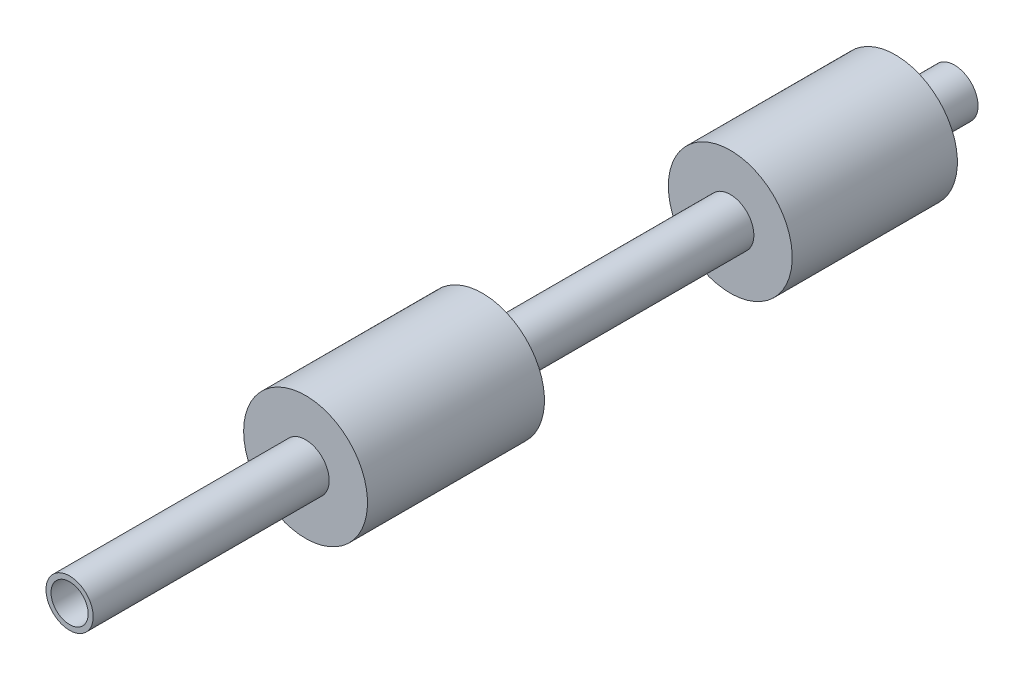
ISO-10303-21;
HEADER;
FILE_DESCRIPTION(('STEP AP214'),'2;1');
FILE_NAME('part.step','',(''),(''),'','','');
FILE_SCHEMA(('AUTOMOTIVE_DESIGN { 1 0 10303 214 1 1 1 1 }'));
ENDSEC;
DATA;
#1=APPLICATION_CONTEXT('core data for automotive mechanical design processes');
#2=APPLICATION_PROTOCOL_DEFINITION('international standard','automotive_design',2000,#1);
#3=PRODUCT_CONTEXT('',#1,'mechanical');
#4=PRODUCT('Part','Part','',(#3));
#5=PRODUCT_RELATED_PRODUCT_CATEGORY('part','',(#4));
#6=PRODUCT_DEFINITION_FORMATION('','',#4);
#7=PRODUCT_DEFINITION_CONTEXT('part definition',#1,'design');
#8=PRODUCT_DEFINITION('design','',#6,#7);
#9=PRODUCT_DEFINITION_SHAPE('','',#8);
#10=(LENGTH_UNIT() NAMED_UNIT(*) SI_UNIT(.MILLI.,.METRE.));
#11=(NAMED_UNIT(*) PLANE_ANGLE_UNIT() SI_UNIT($,.RADIAN.));
#12=(NAMED_UNIT(*) SI_UNIT($,.STERADIAN.) SOLID_ANGLE_UNIT());
#13=UNCERTAINTY_MEASURE_WITH_UNIT(LENGTH_MEASURE(1.E-05),#10,'distance_accuracy_value','');
#14=(GEOMETRIC_REPRESENTATION_CONTEXT(3) GLOBAL_UNCERTAINTY_ASSIGNED_CONTEXT((#13)) GLOBAL_UNIT_ASSIGNED_CONTEXT((#10,
#11,#12)) REPRESENTATION_CONTEXT('',''));
#15=CARTESIAN_POINT('',(0.,0.,0.));
#16=DIRECTION('',(0.,0.,1.));
#17=DIRECTION('',(1.,0.,0.));
#18=AXIS2_PLACEMENT_3D('',#15,#16,#17);
#19=CARTESIAN_POINT('',(0.,0.,149.));
#20=DIRECTION('',(0.,0.,-1.));
#21=DIRECTION('',(-1.,0.,0.));
#22=AXIS2_PLACEMENT_3D('',#19,#20,#21);
#23=CYLINDRICAL_SURFACE('',#22,4.);
#24=CARTESIAN_POINT('',(0.,0.,79.));
#25=DIRECTION('',(0.,0.,-1.));
#26=DIRECTION('',(-1.,0.,0.));
#27=AXIS2_PLACEMENT_3D('',#24,#25,#26);
#28=CIRCLE('',#27,4.);
#29=CARTESIAN_POINT('',(-4.,0.,79.));
#30=VERTEX_POINT('',#29);
#31=EDGE_CURVE('E66',#30,#30,#28,.T.);
#32=ORIENTED_EDGE('',*,*,#31,.T.);
#33=EDGE_LOOP('',(#32));
#34=FACE_BOUND('',#33,.T.);
#35=CARTESIAN_POINT('',(0.,0.,37.));
#36=DIRECTION('',(0.,0.,-1.));
#37=DIRECTION('',(-1.,0.,0.));
#38=AXIS2_PLACEMENT_3D('',#35,#36,#37);
#39=CIRCLE('',#38,4.);
#40=CARTESIAN_POINT('',(-4.,0.,37.));
#41=VERTEX_POINT('',#40);
#42=EDGE_CURVE('E10',#41,#41,#39,.T.);
#43=ORIENTED_EDGE('',*,*,#42,.F.);
#44=EDGE_LOOP('',(#43));
#45=FACE_BOUND('',#44,.T.);
#46=ADVANCED_FACE('F39',(#34,#45),#23,.T.);
#47=CARTESIAN_POINT('',(0.,0.,149.));
#48=DIRECTION('',(0.,0.,1.));
#49=DIRECTION('',(1.,0.,0.));
#50=AXIS2_PLACEMENT_3D('',#47,#48,#49);
#51=CIRCLE('',#50,4.);
#52=CARTESIAN_POINT('',(4.,0.,149.));
#53=VERTEX_POINT('',#52);
#54=EDGE_CURVE('E50',#53,#53,#51,.T.);
#55=ORIENTED_EDGE('',*,*,#54,.F.);
#56=EDGE_LOOP('',(#55));
#57=FACE_BOUND('',#56,.T.);
#58=CARTESIAN_POINT('',(0.,0.,109.));
#59=DIRECTION('',(0.,0.,-1.));
#60=DIRECTION('',(-1.,0.,0.));
#61=AXIS2_PLACEMENT_3D('',#58,#59,#60);
#62=CIRCLE('',#61,4.);
#63=CARTESIAN_POINT('',(-4.,0.,109.));
#64=VERTEX_POINT('',#63);
#65=EDGE_CURVE('E46',#64,#64,#62,.T.);
#66=ORIENTED_EDGE('',*,*,#65,.F.);
#67=EDGE_LOOP('',(#66));
#68=FACE_BOUND('',#67,.T.);
#69=ADVANCED_FACE('F96',(#57,#68),#23,.T.);
#70=CARTESIAN_POINT('',(0.,0.,149.));
#71=DIRECTION('',(0.,0.,1.));
#72=DIRECTION('',(1.,0.,0.));
#73=AXIS2_PLACEMENT_3D('',#70,#71,#72);
#74=PLANE('',#73);
#75=ORIENTED_EDGE('',*,*,#54,.T.);
#76=EDGE_LOOP('',(#75));
#77=FACE_BOUND('',#76,.T.);
#78=CARTESIAN_POINT('',(0.,0.,149.));
#79=DIRECTION('',(0.,0.,1.));
#80=DIRECTION('',(1.,0.,0.));
#81=AXIS2_PLACEMENT_3D('',#78,#79,#80);
#82=CIRCLE('',#81,3.15);
#83=CARTESIAN_POINT('',(3.15,0.,149.));
#84=VERTEX_POINT('',#83);
#85=EDGE_CURVE('E54',#84,#84,#82,.T.);
#86=ORIENTED_EDGE('',*,*,#85,.F.);
#87=EDGE_LOOP('',(#86));
#88=FACE_BOUND('',#87,.T.);
#89=ADVANCED_FACE('F102',(#77,#88),#74,.T.);
#90=CARTESIAN_POINT('',(0.,0.,149.));
#91=DIRECTION('',(0.,0.,-1.));
#92=DIRECTION('',(-1.,0.,0.));
#93=AXIS2_PLACEMENT_3D('',#90,#91,#92);
#94=CYLINDRICAL_SURFACE('',#93,3.15);
#95=CARTESIAN_POINT('',(0.,0.,-1.));
#96=DIRECTION('',(0.,0.,-1.));
#97=DIRECTION('',(-1.,0.,0.));
#98=AXIS2_PLACEMENT_3D('',#95,#96,#97);
#99=CIRCLE('',#98,3.15);
#100=CARTESIAN_POINT('',(-3.15,0.,-1.));
#101=VERTEX_POINT('',#100);
#102=EDGE_CURVE('E80',#101,#101,#99,.T.);
#103=ORIENTED_EDGE('',*,*,#102,.T.);
#104=EDGE_LOOP('',(#103));
#105=FACE_BOUND('',#104,.T.);
#106=ORIENTED_EDGE('',*,*,#85,.T.);
#107=EDGE_LOOP('',(#106));
#108=FACE_BOUND('',#107,.T.);
#109=ADVANCED_FACE('F84',(#105,#108),#94,.F.);
#110=CARTESIAN_POINT('',(0.,0.,109.));
#111=DIRECTION('',(0.,0.,-1.));
#112=DIRECTION('',(-1.,0.,0.));
#113=AXIS2_PLACEMENT_3D('',#110,#111,#112);
#114=CYLINDRICAL_SURFACE('',#113,10.5);
#115=CARTESIAN_POINT('',(0.,0.,109.));
#116=DIRECTION('',(0.,0.,-1.));
#117=DIRECTION('',(-1.,0.,0.));
#118=AXIS2_PLACEMENT_3D('',#115,#116,#117);
#119=CIRCLE('',#118,10.5);
#120=CARTESIAN_POINT('',(-10.5,0.,109.));
#121=VERTEX_POINT('',#120);
#122=EDGE_CURVE('E62',#121,#121,#119,.T.);
#123=ORIENTED_EDGE('',*,*,#122,.T.);
#124=EDGE_LOOP('',(#123));
#125=FACE_BOUND('',#124,.T.);
#126=CARTESIAN_POINT('',(0.,0.,79.));
#127=DIRECTION('',(0.,0.,-1.));
#128=DIRECTION('',(-1.,0.,0.));
#129=AXIS2_PLACEMENT_3D('',#126,#127,#128);
#130=CIRCLE('',#129,10.5);
#131=CARTESIAN_POINT('',(-10.5,0.,79.));
#132=VERTEX_POINT('',#131);
#133=EDGE_CURVE('E63',#132,#132,#130,.T.);
#134=ORIENTED_EDGE('',*,*,#133,.F.);
#135=EDGE_LOOP('',(#134));
#136=FACE_BOUND('',#135,.T.);
#137=ADVANCED_FACE('F113',(#125,#136),#114,.T.);
#138=CARTESIAN_POINT('',(0.,0.,109.));
#139=DIRECTION('',(0.,0.,-1.));
#140=DIRECTION('',(-1.,0.,0.));
#141=AXIS2_PLACEMENT_3D('',#138,#139,#140);
#142=PLANE('',#141);
#143=ORIENTED_EDGE('',*,*,#65,.T.);
#144=EDGE_LOOP('',(#143));
#145=FACE_BOUND('',#144,.T.);
#146=ORIENTED_EDGE('',*,*,#122,.F.);
#147=EDGE_LOOP('',(#146));
#148=FACE_BOUND('',#147,.T.);
#149=ADVANCED_FACE('F118',(#145,#148),#142,.F.);
#150=CARTESIAN_POINT('',(0.,0.,79.));
#151=DIRECTION('',(0.,0.,-1.));
#152=DIRECTION('',(-1.,0.,0.));
#153=AXIS2_PLACEMENT_3D('',#150,#151,#152);
#154=PLANE('',#153);
#155=ORIENTED_EDGE('',*,*,#31,.F.);
#156=EDGE_LOOP('',(#155));
#157=FACE_BOUND('',#156,.T.);
#158=ORIENTED_EDGE('',*,*,#133,.T.);
#159=EDGE_LOOP('',(#158));
#160=FACE_BOUND('',#159,.T.);
#161=ADVANCED_FACE('F122',(#157,#160),#154,.T.);
#162=CARTESIAN_POINT('',(0.,0.,37.));
#163=DIRECTION('',(0.,0.,-1.));
#164=DIRECTION('',(-1.,0.,0.));
#165=AXIS2_PLACEMENT_3D('',#162,#163,#164);
#166=CYLINDRICAL_SURFACE('',#165,10.5);
#167=CARTESIAN_POINT('',(0.,0.,37.));
#168=DIRECTION('',(0.,0.,-1.));
#169=DIRECTION('',(-1.,0.,0.));
#170=AXIS2_PLACEMENT_3D('',#167,#168,#169);
#171=CIRCLE('',#170,10.5);
#172=CARTESIAN_POINT('',(-10.5,0.,37.));
#173=VERTEX_POINT('',#172);
#174=EDGE_CURVE('E71',#173,#173,#171,.T.);
#175=ORIENTED_EDGE('',*,*,#174,.T.);
#176=EDGE_LOOP('',(#175));
#177=FACE_BOUND('',#176,.T.);
#178=CARTESIAN_POINT('',(0.,0.,9.));
#179=DIRECTION('',(0.,0.,-1.));
#180=DIRECTION('',(-1.,0.,0.));
#181=AXIS2_PLACEMENT_3D('',#178,#179,#180);
#182=CIRCLE('',#181,10.5);
#183=CARTESIAN_POINT('',(-10.5,0.,9.));
#184=VERTEX_POINT('',#183);
#185=EDGE_CURVE('E72',#184,#184,#182,.T.);
#186=ORIENTED_EDGE('',*,*,#185,.F.);
#187=EDGE_LOOP('',(#186));
#188=FACE_BOUND('',#187,.T.);
#189=ADVANCED_FACE('F125',(#177,#188),#166,.T.);
#190=CARTESIAN_POINT('',(0.,0.,37.));
#191=DIRECTION('',(0.,0.,-1.));
#192=DIRECTION('',(-1.,0.,0.));
#193=AXIS2_PLACEMENT_3D('',#190,#191,#192);
#194=PLANE('',#193);
#195=ORIENTED_EDGE('',*,*,#42,.T.);
#196=EDGE_LOOP('',(#195));
#197=FACE_BOUND('',#196,.T.);
#198=ORIENTED_EDGE('',*,*,#174,.F.);
#199=EDGE_LOOP('',(#198));
#200=FACE_BOUND('',#199,.T.);
#201=ADVANCED_FACE('F131',(#197,#200),#194,.F.);
#202=CARTESIAN_POINT('',(0.,0.,9.));
#203=DIRECTION('',(0.,0.,-1.));
#204=DIRECTION('',(-1.,0.,0.));
#205=AXIS2_PLACEMENT_3D('',#202,#203,#204);
#206=PLANE('',#205);
#207=CARTESIAN_POINT('',(0.,0.,9.));
#208=DIRECTION('',(0.,0.,-1.));
#209=DIRECTION('',(-1.,0.,0.));
#210=AXIS2_PLACEMENT_3D('',#207,#208,#209);
#211=CIRCLE('',#210,4.);
#212=CARTESIAN_POINT('',(-4.,0.,9.));
#213=VERTEX_POINT('',#212);
#214=EDGE_CURVE('E75',#213,#213,#211,.T.);
#215=ORIENTED_EDGE('',*,*,#214,.F.);
#216=EDGE_LOOP('',(#215));
#217=FACE_BOUND('',#216,.T.);
#218=ORIENTED_EDGE('',*,*,#185,.T.);
#219=EDGE_LOOP('',(#218));
#220=FACE_BOUND('',#219,.T.);
#221=ADVANCED_FACE('F90',(#217,#220),#206,.T.);
#222=CARTESIAN_POINT('',(0.,0.,-1.));
#223=DIRECTION('',(0.,0.,-1.));
#224=DIRECTION('',(-1.,0.,0.));
#225=AXIS2_PLACEMENT_3D('',#222,#223,#224);
#226=PLANE('',#225);
#227=ORIENTED_EDGE('',*,*,#102,.F.);
#228=EDGE_LOOP('',(#227));
#229=FACE_BOUND('',#228,.T.);
#230=CARTESIAN_POINT('',(0.,0.,-1.));
#231=DIRECTION('',(0.,0.,-1.));
#232=DIRECTION('',(-1.,0.,0.));
#233=AXIS2_PLACEMENT_3D('',#230,#231,#232);
#234=CIRCLE('',#233,4.);
#235=CARTESIAN_POINT('',(-4.,0.,-1.));
#236=VERTEX_POINT('',#235);
#237=EDGE_CURVE('E59',#236,#236,#234,.T.);
#238=ORIENTED_EDGE('',*,*,#237,.T.);
#239=EDGE_LOOP('',(#238));
#240=FACE_BOUND('',#239,.T.);
#241=ADVANCED_FACE('F87',(#229,#240),#226,.T.);
#242=ORIENTED_EDGE('',*,*,#214,.T.);
#243=EDGE_LOOP('',(#242));
#244=FACE_BOUND('',#243,.T.);
#245=ORIENTED_EDGE('',*,*,#237,.F.);
#246=EDGE_LOOP('',(#245));
#247=FACE_BOUND('',#246,.T.);
#248=ADVANCED_FACE('F41',(#244,#247),#23,.T.);
#249=CLOSED_SHELL('',(#46,#69,#89,#109,#137,#149,#161,#189,#201,#221,#241,#248));
#250=MANIFOLD_SOLID_BREP('B2',#249);
#251=ADVANCED_BREP_SHAPE_REPRESENTATION('',(#18,#250),#14);
#252=SHAPE_DEFINITION_REPRESENTATION(#9,#251);
ENDSEC;
END-ISO-10303-21;
